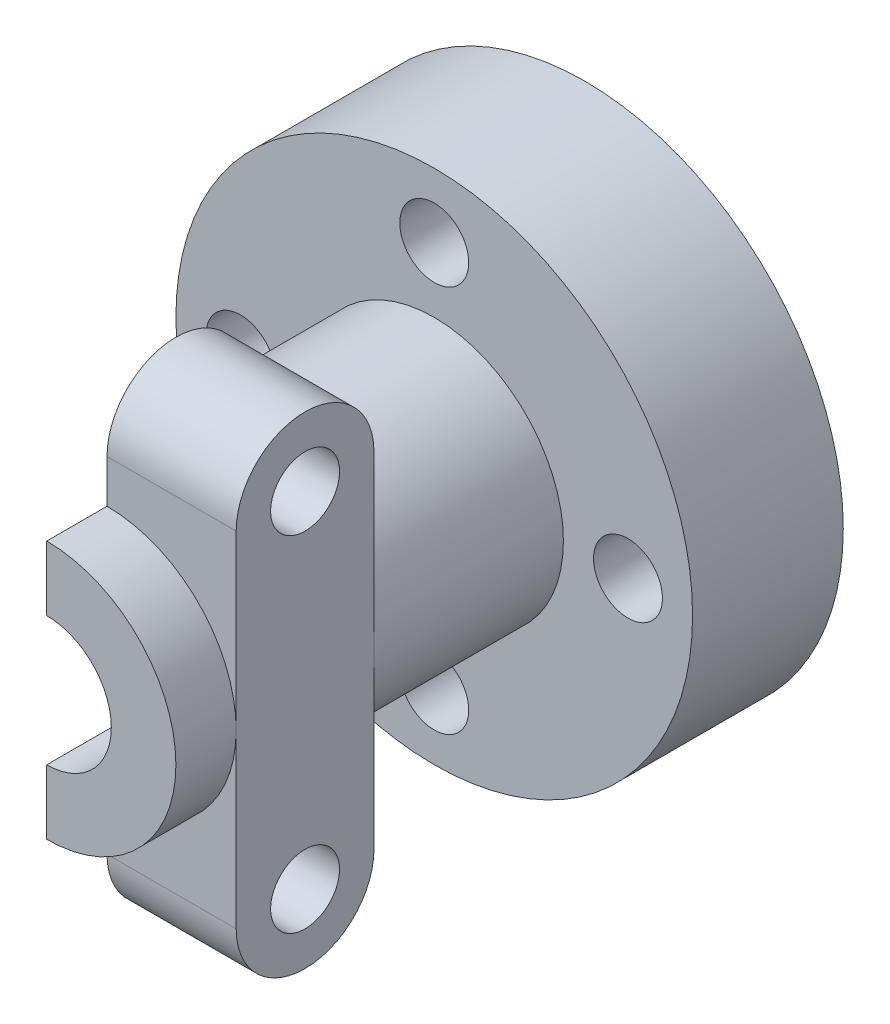
ISO-10303-21;
HEADER;
FILE_DESCRIPTION(('STEP AP214'),'2;1');
FILE_NAME('part.step','',(''),(''),'','','');
FILE_SCHEMA(('AUTOMOTIVE_DESIGN { 1 0 10303 214 1 1 1 1 }'));
ENDSEC;
DATA;
#1=APPLICATION_CONTEXT('core data for automotive mechanical design processes');
#2=APPLICATION_PROTOCOL_DEFINITION('international standard','automotive_design',2000,#1);
#3=PRODUCT_CONTEXT('',#1,'mechanical');
#4=PRODUCT('Part','Part','',(#3));
#5=PRODUCT_RELATED_PRODUCT_CATEGORY('part','',(#4));
#6=PRODUCT_DEFINITION_FORMATION('','',#4);
#7=PRODUCT_DEFINITION_CONTEXT('part definition',#1,'design');
#8=PRODUCT_DEFINITION('design','',#6,#7);
#9=PRODUCT_DEFINITION_SHAPE('','',#8);
#10=(LENGTH_UNIT() NAMED_UNIT(*) SI_UNIT(.MILLI.,.METRE.));
#11=(NAMED_UNIT(*) PLANE_ANGLE_UNIT() SI_UNIT($,.RADIAN.));
#12=(NAMED_UNIT(*) SI_UNIT($,.STERADIAN.) SOLID_ANGLE_UNIT());
#13=UNCERTAINTY_MEASURE_WITH_UNIT(LENGTH_MEASURE(1.E-05),#10,'distance_accuracy_value','');
#14=(GEOMETRIC_REPRESENTATION_CONTEXT(3) GLOBAL_UNCERTAINTY_ASSIGNED_CONTEXT((#13)) GLOBAL_UNIT_ASSIGNED_CONTEXT((#10,
#11,#12)) REPRESENTATION_CONTEXT('',''));
#15=CARTESIAN_POINT('',(0.,0.,0.));
#16=DIRECTION('',(0.,0.,1.));
#17=DIRECTION('',(1.,0.,0.));
#18=AXIS2_PLACEMENT_3D('',#15,#16,#17);
#19=CARTESIAN_POINT('',(0.,0.,0.));
#20=DIRECTION('',(0.,0.,1.));
#21=DIRECTION('',(1.,0.,0.));
#22=AXIS2_PLACEMENT_3D('',#19,#20,#21);
#23=CYLINDRICAL_SURFACE('',#22,10.);
#24=CARTESIAN_POINT('',(0.,0.,65.));
#25=DIRECTION('',(0.,0.,1.));
#26=DIRECTION('',(1.,0.,0.));
#27=AXIS2_PLACEMENT_3D('',#24,#25,#26);
#28=CIRCLE('',#27,10.);
#29=CARTESIAN_POINT('',(10.,0.,65.));
#30=VERTEX_POINT('',#29);
#31=EDGE_CURVE('E11',#30,#30,#28,.F.);
#32=ORIENTED_EDGE('',*,*,#31,.F.);
#33=EDGE_LOOP('',(#32));
#34=FACE_BOUND('',#33,.T.);
#35=CARTESIAN_POINT('',(0.,0.,15.));
#36=DIRECTION('',(0.,0.,-1.));
#37=DIRECTION('',(-1.,0.,0.));
#38=AXIS2_PLACEMENT_3D('',#35,#36,#37);
#39=CIRCLE('',#38,10.);
#40=CARTESIAN_POINT('',(-10.,0.,15.));
#41=VERTEX_POINT('',#40);
#42=EDGE_CURVE('E335',#41,#41,#39,.F.);
#43=ORIENTED_EDGE('',*,*,#42,.F.);
#44=EDGE_LOOP('',(#43));
#45=FACE_BOUND('',#44,.T.);
#46=ADVANCED_FACE('F39',(#34,#45),#23,.F.);
#47=CARTESIAN_POINT('',(-4.71349980743823E-13,-45.,0.));
#48=DIRECTION('',(0.,0.,1.));
#49=DIRECTION('',(1.,0.,0.));
#50=AXIS2_PLACEMENT_3D('',#47,#48,#49);
#51=CYLINDRICAL_SURFACE('',#50,8.);
#52=CARTESIAN_POINT('',(-4.71349980743823E-13,-45.,35.));
#53=DIRECTION('',(0.,0.,1.));
#54=DIRECTION('',(1.,0.,0.));
#55=AXIS2_PLACEMENT_3D('',#52,#53,#54);
#56=CIRCLE('',#55,8.);
#57=CARTESIAN_POINT('',(7.99999999999953,-45.,35.));
#58=VERTEX_POINT('',#57);
#59=EDGE_CURVE('E331',#58,#58,#56,.T.);
#60=ORIENTED_EDGE('',*,*,#59,.T.);
#61=EDGE_LOOP('',(#60));
#62=FACE_BOUND('',#61,.T.);
#63=CARTESIAN_POINT('',(-4.71349980743823E-13,-45.,15.));
#64=DIRECTION('',(0.,0.,-1.));
#65=DIRECTION('',(-1.,0.,0.));
#66=AXIS2_PLACEMENT_3D('',#63,#64,#65);
#67=CIRCLE('',#66,8.);
#68=CARTESIAN_POINT('',(-8.00000000000047,-45.,15.));
#69=VERTEX_POINT('',#68);
#70=EDGE_CURVE('E345',#69,#69,#67,.F.);
#71=ORIENTED_EDGE('',*,*,#70,.F.);
#72=EDGE_LOOP('',(#71));
#73=FACE_BOUND('',#72,.T.);
#74=ADVANCED_FACE('F195',(#62,#73),#51,.F.);
#75=CARTESIAN_POINT('',(45.,-3.14233320495882E-13,0.));
#76=DIRECTION('',(0.,0.,1.));
#77=DIRECTION('',(1.,0.,0.));
#78=AXIS2_PLACEMENT_3D('',#75,#76,#77);
#79=CYLINDRICAL_SURFACE('',#78,7.99999999999999);
#80=CARTESIAN_POINT('',(45.,-3.14233320495882E-13,35.));
#81=DIRECTION('',(0.,0.,1.));
#82=DIRECTION('',(1.,0.,0.));
#83=AXIS2_PLACEMENT_3D('',#80,#81,#82);
#84=CIRCLE('',#83,7.99999999999999);
#85=CARTESIAN_POINT('',(53.,-3.14233320495882E-13,35.));
#86=VERTEX_POINT('',#85);
#87=EDGE_CURVE('E334',#86,#86,#84,.T.);
#88=ORIENTED_EDGE('',*,*,#87,.T.);
#89=EDGE_LOOP('',(#88));
#90=FACE_BOUND('',#89,.T.);
#91=CARTESIAN_POINT('',(45.,-3.14233320495882E-13,15.));
#92=DIRECTION('',(0.,0.,-1.));
#93=DIRECTION('',(-1.,0.,0.));
#94=AXIS2_PLACEMENT_3D('',#91,#92,#93);
#95=CIRCLE('',#94,7.99999999999999);
#96=CARTESIAN_POINT('',(37.,-3.14233320495882E-13,15.));
#97=VERTEX_POINT('',#96);
#98=EDGE_CURVE('E348',#97,#97,#95,.F.);
#99=ORIENTED_EDGE('',*,*,#98,.F.);
#100=EDGE_LOOP('',(#99));
#101=FACE_BOUND('',#100,.T.);
#102=ADVANCED_FACE('F201',(#90,#101),#79,.F.);
#103=CARTESIAN_POINT('',(1.57116660247941E-13,45.,0.));
#104=DIRECTION('',(0.,0.,1.));
#105=DIRECTION('',(1.,0.,0.));
#106=AXIS2_PLACEMENT_3D('',#103,#104,#105);
#107=CYLINDRICAL_SURFACE('',#106,8.);
#108=CARTESIAN_POINT('',(1.57116660247941E-13,45.,35.));
#109=DIRECTION('',(0.,0.,1.));
#110=DIRECTION('',(1.,0.,0.));
#111=AXIS2_PLACEMENT_3D('',#108,#109,#110);
#112=CIRCLE('',#111,8.);
#113=CARTESIAN_POINT('',(8.00000000000015,45.,35.));
#114=VERTEX_POINT('',#113);
#115=EDGE_CURVE('E338',#114,#114,#112,.T.);
#116=ORIENTED_EDGE('',*,*,#115,.T.);
#117=EDGE_LOOP('',(#116));
#118=FACE_BOUND('',#117,.T.);
#119=CARTESIAN_POINT('',(1.57116660247941E-13,45.,15.));
#120=DIRECTION('',(0.,0.,-1.));
#121=DIRECTION('',(-1.,0.,0.));
#122=AXIS2_PLACEMENT_3D('',#119,#120,#121);
#123=CIRCLE('',#122,8.);
#124=CARTESIAN_POINT('',(-7.99999999999984,45.,15.));
#125=VERTEX_POINT('',#124);
#126=EDGE_CURVE('E351',#125,#125,#123,.F.);
#127=ORIENTED_EDGE('',*,*,#126,.F.);
#128=EDGE_LOOP('',(#127));
#129=FACE_BOUND('',#128,.T.);
#130=ADVANCED_FACE('F364',(#118,#129),#107,.F.);
#131=CARTESIAN_POINT('',(-45.,0.,0.));
#132=DIRECTION('',(0.,0.,1.));
#133=DIRECTION('',(1.,0.,0.));
#134=AXIS2_PLACEMENT_3D('',#131,#132,#133);
#135=CYLINDRICAL_SURFACE('',#134,8.);
#136=CARTESIAN_POINT('',(-45.,0.,35.));
#137=DIRECTION('',(0.,0.,1.));
#138=DIRECTION('',(1.,0.,0.));
#139=AXIS2_PLACEMENT_3D('',#136,#137,#138);
#140=CIRCLE('',#139,8.);
#141=CARTESIAN_POINT('',(-37.,0.,35.));
#142=VERTEX_POINT('',#141);
#143=EDGE_CURVE('E329',#142,#142,#140,.T.);
#144=ORIENTED_EDGE('',*,*,#143,.T.);
#145=EDGE_LOOP('',(#144));
#146=FACE_BOUND('',#145,.T.);
#147=CARTESIAN_POINT('',(-45.,0.,15.));
#148=DIRECTION('',(0.,0.,-1.));
#149=DIRECTION('',(-1.,0.,0.));
#150=AXIS2_PLACEMENT_3D('',#147,#148,#149);
#151=CIRCLE('',#150,8.);
#152=CARTESIAN_POINT('',(-53.,0.,15.));
#153=VERTEX_POINT('',#152);
#154=EDGE_CURVE('E43',#153,#153,#151,.F.);
#155=ORIENTED_EDGE('',*,*,#154,.F.);
#156=EDGE_LOOP('',(#155));
#157=FACE_BOUND('',#156,.T.);
#158=ADVANCED_FACE('F363',(#146,#157),#135,.F.);
#159=CARTESIAN_POINT('',(0.,0.,125.));
#160=DIRECTION('',(0.,0.,-1.));
#161=DIRECTION('',(-1.,0.,0.));
#162=AXIS2_PLACEMENT_3D('',#159,#160,#161);
#163=CYLINDRICAL_SURFACE('',#162,30.);
#164=CARTESIAN_POINT('',(0.,0.,125.));
#165=DIRECTION('',(0.,0.,1.));
#166=DIRECTION('',(1.,0.,0.));
#167=AXIS2_PLACEMENT_3D('',#164,#165,#166);
#168=CIRCLE('',#167,30.);
#169=CARTESIAN_POINT('',(0.,-30.,125.000006));
#170=VERTEX_POINT('',#169);
#171=CARTESIAN_POINT('',(0.,30.,125.000006));
#172=VERTEX_POINT('',#171);
#173=EDGE_CURVE('E164',#170,#172,#168,.T.);
#174=ORIENTED_EDGE('',*,*,#173,.F.);
#175=DIRECTION('',(0.,0.,1.));
#176=VECTOR('',#175,1.);
#177=CARTESIAN_POINT('',(0.,-30.,65.));
#178=LINE('',#177,#176);
#179=CARTESIAN_POINT('',(0.,-30.,111.));
#180=VERTEX_POINT('',#179);
#181=EDGE_CURVE('E149',#180,#170,#178,.T.);
#182=ORIENTED_EDGE('',*,*,#181,.F.);
#183=CARTESIAN_POINT('',(0.,0.,111.));
#184=DIRECTION('',(0.,0.,-1.));
#185=DIRECTION('',(0.,1.,0.));
#186=AXIS2_PLACEMENT_3D('',#183,#184,#185);
#187=CIRCLE('',#186,30.);
#188=CARTESIAN_POINT('',(30.,0.,111.));
#189=VERTEX_POINT('',#188);
#190=EDGE_CURVE('E48',#189,#180,#187,.T.);
#191=ORIENTED_EDGE('',*,*,#190,.F.);
#192=CARTESIAN_POINT('',(-1.04744440165294E-13,30.,111.));
#193=VERTEX_POINT('',#192);
#194=EDGE_CURVE('E265',#193,#189,#187,.T.);
#195=ORIENTED_EDGE('',*,*,#194,.F.);
#196=DIRECTION('',(0.,0.,1.));
#197=VECTOR('',#196,1.);
#198=CARTESIAN_POINT('',(-1.04744440165294E-13,30.,65.));
#199=LINE('',#198,#197);
#200=EDGE_CURVE('E154',#193,#172,#199,.T.);
#201=ORIENTED_EDGE('',*,*,#200,.T.);
#202=EDGE_LOOP('',(#174,#182,#191,#195,#201));
#203=FACE_BOUND('',#202,.T.);
#204=ADVANCED_FACE('F240',(#203),#163,.T.);
#205=CARTESIAN_POINT('',(0.,0.,79.));
#206=DIRECTION('',(0.,0.,1.));
#207=DIRECTION('',(0.,-1.,0.));
#208=AXIS2_PLACEMENT_3D('',#205,#206,#207);
#209=CIRCLE('',#208,30.);
#210=CARTESIAN_POINT('',(0.,-30.,79.));
#211=VERTEX_POINT('',#210);
#212=CARTESIAN_POINT('',(30.,0.,79.));
#213=VERTEX_POINT('',#212);
#214=EDGE_CURVE('E264',#211,#213,#209,.T.);
#215=ORIENTED_EDGE('',*,*,#214,.F.);
#216=CARTESIAN_POINT('',(0.,-30.,65.));
#217=VERTEX_POINT('',#216);
#218=EDGE_CURVE('E315',#217,#211,#178,.T.);
#219=ORIENTED_EDGE('',*,*,#218,.F.);
#220=CARTESIAN_POINT('',(0.,0.,65.));
#221=DIRECTION('',(0.,0.,1.));
#222=DIRECTION('',(1.,0.,0.));
#223=AXIS2_PLACEMENT_3D('',#220,#221,#222);
#224=CIRCLE('',#223,30.);
#225=CARTESIAN_POINT('',(-1.04744440165294E-13,30.,65.));
#226=VERTEX_POINT('',#225);
#227=EDGE_CURVE('E322',#226,#217,#224,.T.);
#228=ORIENTED_EDGE('',*,*,#227,.F.);
#229=CARTESIAN_POINT('',(-1.04744440165294E-13,30.,79.));
#230=VERTEX_POINT('',#229);
#231=EDGE_CURVE('E150',#226,#230,#199,.T.);
#232=ORIENTED_EDGE('',*,*,#231,.T.);
#233=EDGE_CURVE('E63',#213,#230,#209,.T.);
#234=ORIENTED_EDGE('',*,*,#233,.F.);
#235=EDGE_LOOP('',(#215,#219,#228,#232,#234));
#236=FACE_BOUND('',#235,.T.);
#237=CARTESIAN_POINT('',(0.,0.,35.));
#238=DIRECTION('',(0.,0.,1.));
#239=DIRECTION('',(1.,0.,0.));
#240=AXIS2_PLACEMENT_3D('',#237,#238,#239);
#241=CIRCLE('',#240,30.);
#242=CARTESIAN_POINT('',(30.,0.,35.));
#243=VERTEX_POINT('',#242);
#244=EDGE_CURVE('E257',#243,#243,#241,.F.);
#245=ORIENTED_EDGE('',*,*,#244,.F.);
#246=EDGE_LOOP('',(#245));
#247=FACE_BOUND('',#246,.T.);
#248=ADVANCED_FACE('F237',(#236,#247),#163,.T.);
#249=CARTESIAN_POINT('',(0.,0.,35.));
#250=DIRECTION('',(0.,0.,-1.));
#251=DIRECTION('',(-1.,0.,0.));
#252=AXIS2_PLACEMENT_3D('',#249,#250,#251);
#253=CYLINDRICAL_SURFACE('',#252,60.);
#254=CARTESIAN_POINT('',(0.,0.,35.));
#255=DIRECTION('',(0.,0.,1.));
#256=DIRECTION('',(1.,0.,0.));
#257=AXIS2_PLACEMENT_3D('',#254,#255,#256);
#258=CIRCLE('',#257,60.);
#259=CARTESIAN_POINT('',(60.,0.,35.));
#260=VERTEX_POINT('',#259);
#261=EDGE_CURVE('E256',#260,#260,#258,.T.);
#262=ORIENTED_EDGE('',*,*,#261,.F.);
#263=EDGE_LOOP('',(#262));
#264=FACE_BOUND('',#263,.T.);
#265=CARTESIAN_POINT('',(0.,0.,0.));
#266=DIRECTION('',(0.,0.,1.));
#267=DIRECTION('',(1.,0.,0.));
#268=AXIS2_PLACEMENT_3D('',#265,#266,#267);
#269=CIRCLE('',#268,60.);
#270=CARTESIAN_POINT('',(60.,0.,0.));
#271=VERTEX_POINT('',#270);
#272=EDGE_CURVE('E254',#271,#271,#269,.T.);
#273=ORIENTED_EDGE('',*,*,#272,.T.);
#274=EDGE_LOOP('',(#273));
#275=FACE_BOUND('',#274,.T.);
#276=ADVANCED_FACE('F41',(#264,#275),#253,.T.);
#277=CARTESIAN_POINT('',(0.,0.,35.));
#278=DIRECTION('',(0.,0.,1.));
#279=DIRECTION('',(1.,0.,0.));
#280=AXIS2_PLACEMENT_3D('',#277,#278,#279);
#281=PLANE('',#280);
#282=ORIENTED_EDGE('',*,*,#143,.F.);
#283=EDGE_LOOP('',(#282));
#284=FACE_BOUND('',#283,.T.);
#285=ORIENTED_EDGE('',*,*,#115,.F.);
#286=EDGE_LOOP('',(#285));
#287=FACE_BOUND('',#286,.T.);
#288=ORIENTED_EDGE('',*,*,#87,.F.);
#289=EDGE_LOOP('',(#288));
#290=FACE_BOUND('',#289,.T.);
#291=ORIENTED_EDGE('',*,*,#59,.F.);
#292=EDGE_LOOP('',(#291));
#293=FACE_BOUND('',#292,.T.);
#294=ORIENTED_EDGE('',*,*,#244,.T.);
#295=EDGE_LOOP('',(#294));
#296=FACE_BOUND('',#295,.T.);
#297=ORIENTED_EDGE('',*,*,#261,.T.);
#298=EDGE_LOOP('',(#297));
#299=FACE_BOUND('',#298,.T.);
#300=ADVANCED_FACE('F241',(#284,#287,#290,#293,#296,#299),#281,.T.);
#301=CARTESIAN_POINT('',(0.,0.,0.));
#302=DIRECTION('',(0.,0.,1.));
#303=DIRECTION('',(1.,0.,0.));
#304=AXIS2_PLACEMENT_3D('',#301,#302,#303);
#305=PLANE('',#304);
#306=CARTESIAN_POINT('',(0.,0.,0.));
#307=DIRECTION('',(0.,0.,-1.));
#308=DIRECTION('',(-1.,0.,0.));
#309=AXIS2_PLACEMENT_3D('',#306,#307,#308);
#310=CIRCLE('',#309,55.);
#311=CARTESIAN_POINT('',(-55.,0.,0.));
#312=VERTEX_POINT('',#311);
#313=EDGE_CURVE('E251',#312,#312,#310,.T.);
#314=ORIENTED_EDGE('',*,*,#313,.F.);
#315=EDGE_LOOP('',(#314));
#316=FACE_BOUND('',#315,.T.);
#317=ORIENTED_EDGE('',*,*,#272,.F.);
#318=EDGE_LOOP('',(#317));
#319=FACE_BOUND('',#318,.T.);
#320=ADVANCED_FACE('F236',(#316,#319),#305,.F.);
#321=CARTESIAN_POINT('',(0.,0.,125.));
#322=DIRECTION('',(0.,0.,1.));
#323=DIRECTION('',(1.,0.,0.));
#324=AXIS2_PLACEMENT_3D('',#321,#322,#323);
#325=PLANE('',#324);
#326=CARTESIAN_POINT('',(0.,0.,125.));
#327=DIRECTION('',(0.,0.,1.));
#328=DIRECTION('',(-1.,0.,0.));
#329=AXIS2_PLACEMENT_3D('',#326,#327,#328);
#330=CIRCLE('',#329,15.);
#331=CARTESIAN_POINT('',(0.,-15.,125.));
#332=VERTEX_POINT('',#331);
#333=CARTESIAN_POINT('',(0.,15.,125.));
#334=VERTEX_POINT('',#333);
#335=EDGE_CURVE('E128',#332,#334,#330,.T.);
#336=ORIENTED_EDGE('',*,*,#335,.F.);
#337=DIRECTION('',(0.,1.,0.));
#338=VECTOR('',#337,1.);
#339=CARTESIAN_POINT('',(0.,0.,125.));
#340=LINE('',#339,#338);
#341=EDGE_CURVE('E142',#170,#332,#340,.T.);
#342=ORIENTED_EDGE('',*,*,#341,.F.);
#343=ORIENTED_EDGE('',*,*,#173,.T.);
#344=EDGE_CURVE('E144',#334,#172,#340,.T.);
#345=ORIENTED_EDGE('',*,*,#344,.F.);
#346=EDGE_LOOP('',(#336,#342,#343,#345));
#347=FACE_BOUND('',#346,.T.);
#348=ADVANCED_FACE('F140',(#347),#325,.T.);
#349=CARTESIAN_POINT('',(30.,40.,111.));
#350=DIRECTION('',(0.,0.,-1.));
#351=DIRECTION('',(0.,1.,0.));
#352=AXIS2_PLACEMENT_3D('',#349,#350,#351);
#353=PLANE('',#352);
#354=DIRECTION('',(0.,-1.,0.));
#355=VECTOR('',#354,1.);
#356=CARTESIAN_POINT('',(0.,40.,111.));
#357=LINE('',#356,#355);
#358=CARTESIAN_POINT('',(0.,40.,111.));
#359=VERTEX_POINT('',#358);
#360=EDGE_CURVE('E299',#359,#193,#357,.T.);
#361=ORIENTED_EDGE('',*,*,#360,.T.);
#362=ORIENTED_EDGE('',*,*,#194,.T.);
#363=DIRECTION('',(0.,-1.,0.));
#364=VECTOR('',#363,1.);
#365=CARTESIAN_POINT('',(30.,40.,111.));
#366=LINE('',#365,#364);
#367=CARTESIAN_POINT('',(30.,40.,111.));
#368=VERTEX_POINT('',#367);
#369=EDGE_CURVE('E569',#368,#189,#366,.T.);
#370=ORIENTED_EDGE('',*,*,#369,.F.);
#371=DIRECTION('',(-1.,0.,0.));
#372=VECTOR('',#371,1.);
#373=CARTESIAN_POINT('',(30.,40.,111.));
#374=LINE('',#373,#372);
#375=EDGE_CURVE('E310',#368,#359,#374,.T.);
#376=ORIENTED_EDGE('',*,*,#375,.T.);
#377=EDGE_LOOP('',(#361,#362,#370,#376));
#378=FACE_BOUND('',#377,.T.);
#379=ADVANCED_FACE('F230',(#378),#353,.F.);
#380=CARTESIAN_POINT('',(30.,40.,79.0000000000001));
#381=DIRECTION('',(0.,0.,1.));
#382=DIRECTION('',(0.,-1.,0.));
#383=AXIS2_PLACEMENT_3D('',#380,#381,#382);
#384=PLANE('',#383);
#385=DIRECTION('',(0.,1.,0.));
#386=VECTOR('',#385,1.);
#387=CARTESIAN_POINT('',(0.,40.,79.0000000000001));
#388=LINE('',#387,#386);
#389=CARTESIAN_POINT('',(0.,-40.,79.));
#390=VERTEX_POINT('',#389);
#391=EDGE_CURVE('E277',#390,#211,#388,.T.);
#392=ORIENTED_EDGE('',*,*,#391,.T.);
#393=ORIENTED_EDGE('',*,*,#214,.T.);
#394=DIRECTION('',(0.,1.,0.));
#395=VECTOR('',#394,1.);
#396=CARTESIAN_POINT('',(30.,40.,79.0000000000001));
#397=LINE('',#396,#395);
#398=CARTESIAN_POINT('',(30.,-40.,79.));
#399=VERTEX_POINT('',#398);
#400=EDGE_CURVE('E275',#399,#213,#397,.T.);
#401=ORIENTED_EDGE('',*,*,#400,.F.);
#402=DIRECTION('',(-1.,0.,0.));
#403=VECTOR('',#402,1.);
#404=CARTESIAN_POINT('',(30.,-40.,79.));
#405=LINE('',#404,#403);
#406=EDGE_CURVE('E291',#399,#390,#405,.T.);
#407=ORIENTED_EDGE('',*,*,#406,.T.);
#408=EDGE_LOOP('',(#392,#393,#401,#407));
#409=FACE_BOUND('',#408,.T.);
#410=ADVANCED_FACE('F212',(#409),#384,.F.);
#411=CARTESIAN_POINT('',(30.,40.,95.));
#412=DIRECTION('',(1.,0.,0.));
#413=DIRECTION('',(0.,0.,-1.));
#414=AXIS2_PLACEMENT_3D('',#411,#412,#413);
#415=PLANE('',#414);
#416=CARTESIAN_POINT('',(30.,-40.,95.));
#417=DIRECTION('',(1.,0.,0.));
#418=DIRECTION('',(0.,0.,-1.));
#419=AXIS2_PLACEMENT_3D('',#416,#417,#418);
#420=CIRCLE('',#419,8.);
#421=CARTESIAN_POINT('',(30.,-40.,87.));
#422=VERTEX_POINT('',#421);
#423=EDGE_CURVE('E171',#422,#422,#420,.T.);
#424=ORIENTED_EDGE('',*,*,#423,.F.);
#425=EDGE_LOOP('',(#424));
#426=FACE_BOUND('',#425,.T.);
#427=CARTESIAN_POINT('',(30.,40.,95.));
#428=DIRECTION('',(1.,0.,0.));
#429=DIRECTION('',(0.,0.,-1.));
#430=AXIS2_PLACEMENT_3D('',#427,#428,#429);
#431=CIRCLE('',#430,8.);
#432=CARTESIAN_POINT('',(30.,40.,87.));
#433=VERTEX_POINT('',#432);
#434=EDGE_CURVE('E326',#433,#433,#431,.T.);
#435=ORIENTED_EDGE('',*,*,#434,.F.);
#436=EDGE_LOOP('',(#435));
#437=FACE_BOUND('',#436,.T.);
#438=ORIENTED_EDGE('',*,*,#400,.T.);
#439=CARTESIAN_POINT('',(30.,40.,79.0000000000001));
#440=VERTEX_POINT('',#439);
#441=EDGE_CURVE('E280',#213,#440,#397,.T.);
#442=ORIENTED_EDGE('',*,*,#441,.T.);
#443=CARTESIAN_POINT('',(30.,40.,95.));
#444=DIRECTION('',(1.,0.,0.));
#445=DIRECTION('',(0.,0.,-1.));
#446=AXIS2_PLACEMENT_3D('',#443,#444,#445);
#447=CIRCLE('',#446,16.);
#448=EDGE_CURVE('E304',#440,#368,#447,.T.);
#449=ORIENTED_EDGE('',*,*,#448,.T.);
#450=ORIENTED_EDGE('',*,*,#369,.T.);
#451=CARTESIAN_POINT('',(30.,-40.,111.));
#452=VERTEX_POINT('',#451);
#453=EDGE_CURVE('E568',#189,#452,#366,.T.);
#454=ORIENTED_EDGE('',*,*,#453,.T.);
#455=CARTESIAN_POINT('',(30.,-40.,95.));
#456=DIRECTION('',(1.,0.,0.));
#457=DIRECTION('',(0.,0.,-1.));
#458=AXIS2_PLACEMENT_3D('',#455,#456,#457);
#459=CIRCLE('',#458,16.);
#460=EDGE_CURVE('E287',#452,#399,#459,.T.);
#461=ORIENTED_EDGE('',*,*,#460,.T.);
#462=EDGE_LOOP('',(#438,#442,#449,#450,#454,#461));
#463=FACE_BOUND('',#462,.T.);
#464=ADVANCED_FACE('F209',(#426,#437,#463),#415,.T.);
#465=CARTESIAN_POINT('',(0.,40.,95.));
#466=DIRECTION('',(1.,0.,0.));
#467=DIRECTION('',(0.,0.,-1.));
#468=AXIS2_PLACEMENT_3D('',#465,#466,#467);
#469=PLANE('',#468);
#470=CARTESIAN_POINT('',(0.,-40.,95.));
#471=DIRECTION('',(1.,0.,0.));
#472=DIRECTION('',(0.,0.,-1.));
#473=AXIS2_PLACEMENT_3D('',#470,#471,#472);
#474=CIRCLE('',#473,8.);
#475=CARTESIAN_POINT('',(0.,-40.,87.));
#476=VERTEX_POINT('',#475);
#477=EDGE_CURVE('E145',#476,#476,#474,.T.);
#478=ORIENTED_EDGE('',*,*,#477,.T.);
#479=EDGE_LOOP('',(#478));
#480=FACE_BOUND('',#479,.T.);
#481=ORIENTED_EDGE('',*,*,#341,.T.);
#482=DIRECTION('',(0.,0.,1.));
#483=VECTOR('',#482,1.);
#484=CARTESIAN_POINT('',(0.,-15.,31.4589803375031));
#485=LINE('',#484,#483);
#486=CARTESIAN_POINT('',(0.,-15.,65.));
#487=VERTEX_POINT('',#486);
#488=EDGE_CURVE('E124',#487,#332,#485,.T.);
#489=ORIENTED_EDGE('',*,*,#488,.F.);
#490=DIRECTION('',(0.,1.,0.));
#491=VECTOR('',#490,1.);
#492=CARTESIAN_POINT('',(-1.04744440165294E-13,30.,65.));
#493=LINE('',#492,#491);
#494=EDGE_CURVE('E316',#217,#487,#493,.T.);
#495=ORIENTED_EDGE('',*,*,#494,.F.);
#496=ORIENTED_EDGE('',*,*,#218,.T.);
#497=ORIENTED_EDGE('',*,*,#391,.F.);
#498=CARTESIAN_POINT('',(0.,-40.,95.));
#499=DIRECTION('',(1.,0.,0.));
#500=DIRECTION('',(0.,0.,-1.));
#501=AXIS2_PLACEMENT_3D('',#498,#499,#500);
#502=CIRCLE('',#501,16.);
#503=CARTESIAN_POINT('',(0.,-40.,111.));
#504=VERTEX_POINT('',#503);
#505=EDGE_CURVE('E301',#504,#390,#502,.T.);
#506=ORIENTED_EDGE('',*,*,#505,.F.);
#507=EDGE_CURVE('E298',#180,#504,#357,.T.);
#508=ORIENTED_EDGE('',*,*,#507,.F.);
#509=ORIENTED_EDGE('',*,*,#181,.T.);
#510=EDGE_LOOP('',(#481,#489,#495,#496,#497,#506,#508,#509));
#511=FACE_BOUND('',#510,.T.);
#512=ADVANCED_FACE('F147',(#480,#511),#469,.F.);
#513=CARTESIAN_POINT('',(0.,40.,95.));
#514=DIRECTION('',(1.,0.,0.));
#515=DIRECTION('',(0.,0.,-1.));
#516=AXIS2_PLACEMENT_3D('',#513,#514,#515);
#517=CIRCLE('',#516,8.);
#518=CARTESIAN_POINT('',(0.,40.,87.));
#519=VERTEX_POINT('',#518);
#520=EDGE_CURVE('E169',#519,#519,#517,.T.);
#521=ORIENTED_EDGE('',*,*,#520,.T.);
#522=EDGE_LOOP('',(#521));
#523=FACE_BOUND('',#522,.T.);
#524=CARTESIAN_POINT('',(0.,15.,65.));
#525=VERTEX_POINT('',#524);
#526=EDGE_CURVE('E321',#525,#226,#493,.T.);
#527=ORIENTED_EDGE('',*,*,#526,.F.);
#528=DIRECTION('',(0.,0.,1.));
#529=VECTOR('',#528,1.);
#530=CARTESIAN_POINT('',(0.,15.,31.4589803375031));
#531=LINE('',#530,#529);
#532=EDGE_CURVE('E135',#525,#334,#531,.T.);
#533=ORIENTED_EDGE('',*,*,#532,.T.);
#534=ORIENTED_EDGE('',*,*,#344,.T.);
#535=ORIENTED_EDGE('',*,*,#200,.F.);
#536=ORIENTED_EDGE('',*,*,#360,.F.);
#537=CARTESIAN_POINT('',(0.,40.,95.));
#538=DIRECTION('',(1.,0.,0.));
#539=DIRECTION('',(0.,0.,-1.));
#540=AXIS2_PLACEMENT_3D('',#537,#538,#539);
#541=CIRCLE('',#540,16.);
#542=CARTESIAN_POINT('',(0.,40.,79.0000000000001));
#543=VERTEX_POINT('',#542);
#544=EDGE_CURVE('E152',#543,#359,#541,.T.);
#545=ORIENTED_EDGE('',*,*,#544,.F.);
#546=EDGE_CURVE('E303',#230,#543,#388,.T.);
#547=ORIENTED_EDGE('',*,*,#546,.F.);
#548=ORIENTED_EDGE('',*,*,#231,.F.);
#549=EDGE_LOOP('',(#527,#533,#534,#535,#536,#545,#547,#548));
#550=FACE_BOUND('',#549,.T.);
#551=ADVANCED_FACE('F216',(#523,#550),#469,.F.);
#552=CARTESIAN_POINT('',(30.,40.,95.));
#553=DIRECTION('',(-1.,0.,0.));
#554=DIRECTION('',(0.,0.,1.));
#555=AXIS2_PLACEMENT_3D('',#552,#553,#554);
#556=CYLINDRICAL_SURFACE('',#555,16.);
#557=ORIENTED_EDGE('',*,*,#544,.T.);
#558=ORIENTED_EDGE('',*,*,#375,.F.);
#559=ORIENTED_EDGE('',*,*,#448,.F.);
#560=DIRECTION('',(-1.,0.,0.));
#561=VECTOR('',#560,1.);
#562=CARTESIAN_POINT('',(30.,40.,79.0000000000001));
#563=LINE('',#562,#561);
#564=EDGE_CURVE('E283',#440,#543,#563,.T.);
#565=ORIENTED_EDGE('',*,*,#564,.T.);
#566=EDGE_LOOP('',(#557,#558,#559,#565));
#567=FACE_BOUND('',#566,.T.);
#568=ADVANCED_FACE('F228',(#567),#556,.T.);
#569=ORIENTED_EDGE('',*,*,#453,.F.);
#570=ORIENTED_EDGE('',*,*,#190,.T.);
#571=ORIENTED_EDGE('',*,*,#507,.T.);
#572=DIRECTION('',(-1.,0.,0.));
#573=VECTOR('',#572,1.);
#574=CARTESIAN_POINT('',(30.,-40.,111.));
#575=LINE('',#574,#573);
#576=EDGE_CURVE('E307',#452,#504,#575,.T.);
#577=ORIENTED_EDGE('',*,*,#576,.F.);
#578=EDGE_LOOP('',(#569,#570,#571,#577));
#579=FACE_BOUND('',#578,.T.);
#580=ADVANCED_FACE('F224',(#579),#353,.F.);
#581=CARTESIAN_POINT('',(30.,-40.,95.));
#582=DIRECTION('',(-1.,0.,0.));
#583=DIRECTION('',(0.,0.,1.));
#584=AXIS2_PLACEMENT_3D('',#581,#582,#583);
#585=CYLINDRICAL_SURFACE('',#584,16.);
#586=ORIENTED_EDGE('',*,*,#505,.T.);
#587=ORIENTED_EDGE('',*,*,#406,.F.);
#588=ORIENTED_EDGE('',*,*,#460,.F.);
#589=ORIENTED_EDGE('',*,*,#576,.T.);
#590=EDGE_LOOP('',(#586,#587,#588,#589));
#591=FACE_BOUND('',#590,.T.);
#592=ADVANCED_FACE('F220',(#591),#585,.T.);
#593=ORIENTED_EDGE('',*,*,#441,.F.);
#594=ORIENTED_EDGE('',*,*,#233,.T.);
#595=ORIENTED_EDGE('',*,*,#546,.T.);
#596=ORIENTED_EDGE('',*,*,#564,.F.);
#597=EDGE_LOOP('',(#593,#594,#595,#596));
#598=FACE_BOUND('',#597,.T.);
#599=ADVANCED_FACE('F217',(#598),#384,.F.);
#600=CARTESIAN_POINT('',(0.,0.,65.));
#601=DIRECTION('',(0.,0.,1.));
#602=DIRECTION('',(1.,0.,0.));
#603=AXIS2_PLACEMENT_3D('',#600,#601,#602);
#604=PLANE('',#603);
#605=CARTESIAN_POINT('',(0.,0.,65.));
#606=DIRECTION('',(0.,0.,1.));
#607=DIRECTION('',(1.,0.,0.));
#608=AXIS2_PLACEMENT_3D('',#605,#606,#607);
#609=CIRCLE('',#608,15.);
#610=EDGE_CURVE('E130',#525,#487,#609,.F.);
#611=ORIENTED_EDGE('',*,*,#610,.F.);
#612=ORIENTED_EDGE('',*,*,#526,.T.);
#613=ORIENTED_EDGE('',*,*,#227,.T.);
#614=ORIENTED_EDGE('',*,*,#494,.T.);
#615=EDGE_LOOP('',(#611,#612,#613,#614));
#616=FACE_BOUND('',#615,.T.);
#617=ORIENTED_EDGE('',*,*,#31,.T.);
#618=EDGE_LOOP('',(#617));
#619=FACE_BOUND('',#618,.T.);
#620=ADVANCED_FACE('F207',(#616,#619),#604,.T.);
#621=CARTESIAN_POINT('',(0.,0.,31.4589803375031));
#622=DIRECTION('',(0.,0.,1.));
#623=DIRECTION('',(1.,0.,0.));
#624=AXIS2_PLACEMENT_3D('',#621,#622,#623);
#625=CYLINDRICAL_SURFACE('',#624,15.);
#626=ORIENTED_EDGE('',*,*,#610,.T.);
#627=ORIENTED_EDGE('',*,*,#488,.T.);
#628=ORIENTED_EDGE('',*,*,#335,.T.);
#629=ORIENTED_EDGE('',*,*,#532,.F.);
#630=EDGE_LOOP('',(#626,#627,#628,#629));
#631=FACE_BOUND('',#630,.T.);
#632=ADVANCED_FACE('F126',(#631),#625,.F.);
#633=CARTESIAN_POINT('',(-60.,40.,95.));
#634=DIRECTION('',(1.,0.,0.));
#635=DIRECTION('',(0.,0.,-1.));
#636=AXIS2_PLACEMENT_3D('',#633,#634,#635);
#637=CYLINDRICAL_SURFACE('',#636,8.);
#638=CARTESIAN_POINT('',(30.,40.,87.));
#639=CARTESIAN_POINT('',(29.6875,40.,87.));
#640=CARTESIAN_POINT('',(29.375,40.,87.));
#641=CARTESIAN_POINT('',(28.75,40.,87.));
#642=CARTESIAN_POINT('',(28.4375,40.,87.));
#643=CARTESIAN_POINT('',(27.8125,40.,87.));
#644=CARTESIAN_POINT('',(27.5,40.,87.));
#645=CARTESIAN_POINT('',(26.875,40.,87.));
#646=CARTESIAN_POINT('',(26.5625,40.,87.));
#647=CARTESIAN_POINT('',(25.9375,40.,87.));
#648=CARTESIAN_POINT('',(25.625,40.,87.));
#649=CARTESIAN_POINT('',(25.,40.,87.));
#650=CARTESIAN_POINT('',(24.6875,40.,87.));
#651=CARTESIAN_POINT('',(24.0625,40.,87.));
#652=CARTESIAN_POINT('',(23.75,40.,87.));
#653=CARTESIAN_POINT('',(23.125,40.,87.));
#654=CARTESIAN_POINT('',(22.8125,40.,87.));
#655=CARTESIAN_POINT('',(22.1875,40.,87.));
#656=CARTESIAN_POINT('',(21.875,40.,87.));
#657=CARTESIAN_POINT('',(21.25,40.,87.));
#658=CARTESIAN_POINT('',(20.9375,40.,87.));
#659=CARTESIAN_POINT('',(20.3125,40.,87.));
#660=CARTESIAN_POINT('',(20.,40.,87.));
#661=CARTESIAN_POINT('',(19.375,40.,87.));
#662=CARTESIAN_POINT('',(19.0625,40.,87.));
#663=CARTESIAN_POINT('',(18.4375,40.,87.));
#664=CARTESIAN_POINT('',(18.125,40.,87.));
#665=CARTESIAN_POINT('',(17.5,40.,87.));
#666=CARTESIAN_POINT('',(17.1875,40.,87.));
#667=CARTESIAN_POINT('',(16.5625,40.,87.));
#668=CARTESIAN_POINT('',(16.25,40.,87.));
#669=CARTESIAN_POINT('',(15.625,40.,87.));
#670=CARTESIAN_POINT('',(15.3125,40.,87.));
#671=CARTESIAN_POINT('',(14.6875,40.,87.));
#672=CARTESIAN_POINT('',(14.375,40.,87.));
#673=CARTESIAN_POINT('',(13.75,40.,87.));
#674=CARTESIAN_POINT('',(13.4375,40.,87.));
#675=CARTESIAN_POINT('',(12.8125,40.,87.));
#676=CARTESIAN_POINT('',(12.5,40.,87.));
#677=CARTESIAN_POINT('',(11.875,40.,87.));
#678=CARTESIAN_POINT('',(11.5625,40.,87.));
#679=CARTESIAN_POINT('',(10.9375,40.,87.));
#680=CARTESIAN_POINT('',(10.625,40.,87.));
#681=CARTESIAN_POINT('',(9.99999999999999,40.,87.));
#682=CARTESIAN_POINT('',(9.68749999999998,40.,87.));
#683=CARTESIAN_POINT('',(9.06249999999998,40.,87.));
#684=CARTESIAN_POINT('',(8.74999999999999,40.,87.));
#685=CARTESIAN_POINT('',(8.12499999999999,40.,87.));
#686=CARTESIAN_POINT('',(7.81249999999999,40.,87.));
#687=CARTESIAN_POINT('',(7.18749999999999,40.,87.));
#688=CARTESIAN_POINT('',(6.87499999999999,40.,87.));
#689=CARTESIAN_POINT('',(6.24999999999998,40.,87.));
#690=CARTESIAN_POINT('',(5.93749999999998,40.,87.));
#691=CARTESIAN_POINT('',(5.31249999999998,40.,87.));
#692=CARTESIAN_POINT('',(4.99999999999998,40.,87.));
#693=CARTESIAN_POINT('',(4.37499999999999,40.,87.));
#694=CARTESIAN_POINT('',(4.06249999999999,40.,87.));
#695=CARTESIAN_POINT('',(3.43749999999999,40.,87.));
#696=CARTESIAN_POINT('',(3.12499999999998,40.,87.));
#697=CARTESIAN_POINT('',(2.49999999999999,40.,87.));
#698=CARTESIAN_POINT('',(2.18749999999999,40.,87.));
#699=CARTESIAN_POINT('',(1.56249999999999,40.,87.));
#700=CARTESIAN_POINT('',(1.24999999999999,40.,87.));
#701=CARTESIAN_POINT('',(0.624999999999994,40.,87.));
#702=CARTESIAN_POINT('',(0.312499999999994,40.,87.));
#703=CARTESIAN_POINT('',(0.,40.,87.));
#704=B_SPLINE_CURVE_WITH_KNOTS('',3,(#638,#639,#640,#641,#642,#643,#644,#645,#646,#647,#648,
#649,#650,#651,#652,#653,#654,#655,#656,#657,#658,#659,#660,#661,#662,#663,#664,#665,#666,#667,
#668,#669,#670,#671,#672,#673,#674,#675,#676,#677,#678,#679,#680,#681,#682,#683,#684,#685,#686,
#687,#688,#689,#690,#691,#692,#693,#694,#695,#696,#697,#698,#699,#700,#701,#702,#703),
.UNSPECIFIED.,.F.,.F.,(4,2,2,2,2,2,2,2,2,2,2,2,2,2,2,2,2,2,2,2,2,2,2,2,2,2,2,2,2,2,2,2,4),(0.,
0.937499999999994,1.875,2.8125,3.75,4.6875,5.62500000000001,6.5625,7.50000000000001,8.4375,
9.37499999999999,10.3125,11.25,12.1875,13.125,14.0625,15.,15.9375,16.875,17.8125,18.75,19.6875,
20.625,21.5625,22.5,23.4375,24.375,25.3125,26.25,27.1875,28.125,29.0625,30.),.UNSPECIFIED.);
#705=EDGE_CURVE('BSEAM179',#433,#519,#704,.T.);
#706=ORIENTED_EDGE('',*,*,#434,.T.);
#707=ORIENTED_EDGE('',*,*,#520,.F.);
#708=ORIENTED_EDGE('',*,*,#705,.T.);
#709=ORIENTED_EDGE('',*,*,#705,.F.);
#710=EDGE_LOOP('',(#706,#708,#707,#709));
#711=FACE_BOUND('',#710,.T.);
#712=ADVANCED_FACE('F179',(#711),#637,.F.);
#713=CARTESIAN_POINT('',(-60.,-40.,95.));
#714=DIRECTION('',(1.,0.,0.));
#715=DIRECTION('',(0.,0.,-1.));
#716=AXIS2_PLACEMENT_3D('',#713,#714,#715);
#717=CYLINDRICAL_SURFACE('',#716,8.);
#718=CARTESIAN_POINT('',(30.,-40.,87.));
#719=CARTESIAN_POINT('',(29.6875,-40.,87.));
#720=CARTESIAN_POINT('',(29.375,-40.,87.));
#721=CARTESIAN_POINT('',(28.75,-40.,87.));
#722=CARTESIAN_POINT('',(28.4375,-40.,87.));
#723=CARTESIAN_POINT('',(27.8125,-40.,87.));
#724=CARTESIAN_POINT('',(27.5,-40.,87.));
#725=CARTESIAN_POINT('',(26.875,-40.,87.));
#726=CARTESIAN_POINT('',(26.5625,-40.,87.));
#727=CARTESIAN_POINT('',(25.9375,-40.,87.));
#728=CARTESIAN_POINT('',(25.625,-40.,87.));
#729=CARTESIAN_POINT('',(25.,-40.,87.));
#730=CARTESIAN_POINT('',(24.6875,-40.,87.));
#731=CARTESIAN_POINT('',(24.0625,-40.,87.));
#732=CARTESIAN_POINT('',(23.75,-40.,87.));
#733=CARTESIAN_POINT('',(23.125,-40.,87.));
#734=CARTESIAN_POINT('',(22.8125,-40.,87.));
#735=CARTESIAN_POINT('',(22.1875,-40.,87.));
#736=CARTESIAN_POINT('',(21.875,-40.,87.));
#737=CARTESIAN_POINT('',(21.25,-40.,87.));
#738=CARTESIAN_POINT('',(20.9375,-40.,87.));
#739=CARTESIAN_POINT('',(20.3125,-40.,87.));
#740=CARTESIAN_POINT('',(20.,-40.,87.));
#741=CARTESIAN_POINT('',(19.375,-40.,87.));
#742=CARTESIAN_POINT('',(19.0625,-40.,87.));
#743=CARTESIAN_POINT('',(18.4375,-40.,87.));
#744=CARTESIAN_POINT('',(18.125,-40.,87.));
#745=CARTESIAN_POINT('',(17.5,-40.,87.));
#746=CARTESIAN_POINT('',(17.1875,-40.,87.));
#747=CARTESIAN_POINT('',(16.5625,-40.,87.));
#748=CARTESIAN_POINT('',(16.25,-40.,87.));
#749=CARTESIAN_POINT('',(15.625,-40.,87.));
#750=CARTESIAN_POINT('',(15.3125,-40.,87.));
#751=CARTESIAN_POINT('',(14.6875,-40.,87.));
#752=CARTESIAN_POINT('',(14.375,-40.,87.));
#753=CARTESIAN_POINT('',(13.75,-40.,87.));
#754=CARTESIAN_POINT('',(13.4375,-40.,87.));
#755=CARTESIAN_POINT('',(12.8125,-40.,87.));
#756=CARTESIAN_POINT('',(12.5,-40.,87.));
#757=CARTESIAN_POINT('',(11.875,-40.,87.));
#758=CARTESIAN_POINT('',(11.5625,-40.,87.));
#759=CARTESIAN_POINT('',(10.9375,-40.,87.));
#760=CARTESIAN_POINT('',(10.625,-40.,87.));
#761=CARTESIAN_POINT('',(9.99999999999999,-40.,87.));
#762=CARTESIAN_POINT('',(9.68749999999998,-40.,87.));
#763=CARTESIAN_POINT('',(9.06249999999998,-40.,87.));
#764=CARTESIAN_POINT('',(8.74999999999999,-40.,87.));
#765=CARTESIAN_POINT('',(8.12499999999999,-40.,87.));
#766=CARTESIAN_POINT('',(7.81249999999999,-40.,87.));
#767=CARTESIAN_POINT('',(7.18749999999999,-40.,87.));
#768=CARTESIAN_POINT('',(6.87499999999999,-40.,87.));
#769=CARTESIAN_POINT('',(6.24999999999998,-40.,87.));
#770=CARTESIAN_POINT('',(5.93749999999998,-40.,87.));
#771=CARTESIAN_POINT('',(5.31249999999998,-40.,87.));
#772=CARTESIAN_POINT('',(4.99999999999998,-40.,87.));
#773=CARTESIAN_POINT('',(4.37499999999999,-40.,87.));
#774=CARTESIAN_POINT('',(4.06249999999999,-40.,87.));
#775=CARTESIAN_POINT('',(3.43749999999999,-40.,87.));
#776=CARTESIAN_POINT('',(3.12499999999998,-40.,87.));
#777=CARTESIAN_POINT('',(2.49999999999999,-40.,87.));
#778=CARTESIAN_POINT('',(2.18749999999999,-40.,87.));
#779=CARTESIAN_POINT('',(1.56249999999999,-40.,87.));
#780=CARTESIAN_POINT('',(1.24999999999999,-40.,87.));
#781=CARTESIAN_POINT('',(0.624999999999994,-40.,87.));
#782=CARTESIAN_POINT('',(0.312499999999994,-40.,87.));
#783=CARTESIAN_POINT('',(0.,-40.,87.));
#784=B_SPLINE_CURVE_WITH_KNOTS('',3,(#718,#719,#720,#721,#722,#723,#724,#725,#726,#727,#728,
#729,#730,#731,#732,#733,#734,#735,#736,#737,#738,#739,#740,#741,#742,#743,#744,#745,#746,#747,
#748,#749,#750,#751,#752,#753,#754,#755,#756,#757,#758,#759,#760,#761,#762,#763,#764,#765,#766,
#767,#768,#769,#770,#771,#772,#773,#774,#775,#776,#777,#778,#779,#780,#781,#782,#783),
.UNSPECIFIED.,.F.,.F.,(4,2,2,2,2,2,2,2,2,2,2,2,2,2,2,2,2,2,2,2,2,2,2,2,2,2,2,2,2,2,2,2,4),(0.,
0.937499999999994,1.875,2.8125,3.75,4.6875,5.62500000000001,6.5625,7.50000000000001,8.4375,
9.37499999999999,10.3125,11.25,12.1875,13.125,14.0625,15.,15.9375,16.875,17.8125,18.75,19.6875,
20.625,21.5625,22.5,23.4375,24.375,25.3125,26.25,27.1875,28.125,29.0625,30.),.UNSPECIFIED.);
#785=EDGE_CURVE('BSEAM176',#422,#476,#784,.T.);
#786=ORIENTED_EDGE('',*,*,#423,.T.);
#787=ORIENTED_EDGE('',*,*,#477,.F.);
#788=ORIENTED_EDGE('',*,*,#785,.T.);
#789=ORIENTED_EDGE('',*,*,#785,.F.);
#790=EDGE_LOOP('',(#786,#788,#787,#789));
#791=FACE_BOUND('',#790,.T.);
#792=ADVANCED_FACE('F176',(#791),#717,.F.);
#793=CARTESIAN_POINT('',(0.,0.,15.));
#794=DIRECTION('',(0.,0.,-1.));
#795=DIRECTION('',(-1.,0.,0.));
#796=AXIS2_PLACEMENT_3D('',#793,#794,#795);
#797=PLANE('',#796);
#798=CARTESIAN_POINT('',(0.,0.,15.));
#799=DIRECTION('',(0.,0.,-1.));
#800=DIRECTION('',(-1.,0.,0.));
#801=AXIS2_PLACEMENT_3D('',#798,#799,#800);
#802=CIRCLE('',#801,55.);
#803=CARTESIAN_POINT('',(-55.,0.,15.));
#804=VERTEX_POINT('',#803);
#805=EDGE_CURVE('E355',#804,#804,#802,.T.);
#806=ORIENTED_EDGE('',*,*,#805,.T.);
#807=EDGE_LOOP('',(#806));
#808=FACE_BOUND('',#807,.T.);
#809=ORIENTED_EDGE('',*,*,#154,.T.);
#810=EDGE_LOOP('',(#809));
#811=FACE_BOUND('',#810,.T.);
#812=ORIENTED_EDGE('',*,*,#126,.T.);
#813=EDGE_LOOP('',(#812));
#814=FACE_BOUND('',#813,.T.);
#815=ORIENTED_EDGE('',*,*,#98,.T.);
#816=EDGE_LOOP('',(#815));
#817=FACE_BOUND('',#816,.T.);
#818=ORIENTED_EDGE('',*,*,#70,.T.);
#819=EDGE_LOOP('',(#818));
#820=FACE_BOUND('',#819,.T.);
#821=ORIENTED_EDGE('',*,*,#42,.T.);
#822=EDGE_LOOP('',(#821));
#823=FACE_BOUND('',#822,.T.);
#824=ADVANCED_FACE('F178',(#808,#811,#814,#817,#820,#823),#797,.T.);
#825=CARTESIAN_POINT('',(0.,0.,15.));
#826=DIRECTION('',(0.,0.,-1.));
#827=DIRECTION('',(-1.,0.,0.));
#828=AXIS2_PLACEMENT_3D('',#825,#826,#827);
#829=CYLINDRICAL_SURFACE('',#828,55.);
#830=ORIENTED_EDGE('',*,*,#805,.F.);
#831=EDGE_LOOP('',(#830));
#832=FACE_BOUND('',#831,.T.);
#833=ORIENTED_EDGE('',*,*,#313,.T.);
#834=EDGE_LOOP('',(#833));
#835=FACE_BOUND('',#834,.T.);
#836=ADVANCED_FACE('F187',(#832,#835),#829,.F.);
#837=CLOSED_SHELL('',(#46,#74,#102,#130,#158,#204,#248,#276,#300,#320,#348,#379,#410,#464,#512,
#551,#568,#580,#592,#599,#620,#632,#712,#792,#824,#836));
#838=MANIFOLD_SOLID_BREP('B2',#837);
#839=ADVANCED_BREP_SHAPE_REPRESENTATION('',(#18,#838),#14);
#840=SHAPE_DEFINITION_REPRESENTATION(#9,#839);
ENDSEC;
END-ISO-10303-21;
